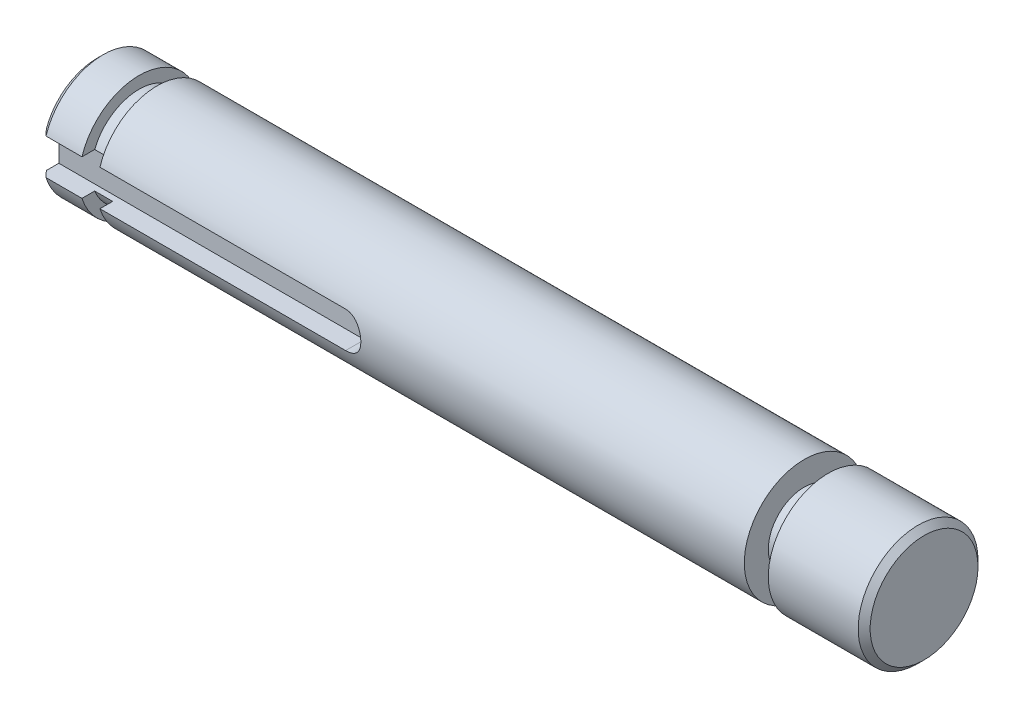
ISO-10303-21;
HEADER;
FILE_DESCRIPTION(('STEP AP214'),'2;1');
FILE_NAME('part.step','',(''),(''),'','','');
FILE_SCHEMA(('AUTOMOTIVE_DESIGN { 1 0 10303 214 1 1 1 1 }'));
ENDSEC;
DATA;
#1=APPLICATION_CONTEXT('core data for automotive mechanical design processes');
#2=APPLICATION_PROTOCOL_DEFINITION('international standard','automotive_design',2000,#1);
#3=PRODUCT_CONTEXT('',#1,'mechanical');
#4=PRODUCT('Part','Part','',(#3));
#5=PRODUCT_RELATED_PRODUCT_CATEGORY('part','',(#4));
#6=PRODUCT_DEFINITION_FORMATION('','',#4);
#7=PRODUCT_DEFINITION_CONTEXT('part definition',#1,'design');
#8=PRODUCT_DEFINITION('design','',#6,#7);
#9=PRODUCT_DEFINITION_SHAPE('','',#8);
#10=(LENGTH_UNIT() NAMED_UNIT(*) SI_UNIT(.MILLI.,.METRE.));
#11=(NAMED_UNIT(*) PLANE_ANGLE_UNIT() SI_UNIT($,.RADIAN.));
#12=(NAMED_UNIT(*) SI_UNIT($,.STERADIAN.) SOLID_ANGLE_UNIT());
#13=UNCERTAINTY_MEASURE_WITH_UNIT(LENGTH_MEASURE(1.E-05),#10,'distance_accuracy_value','');
#14=(GEOMETRIC_REPRESENTATION_CONTEXT(3) GLOBAL_UNCERTAINTY_ASSIGNED_CONTEXT((#13)) GLOBAL_UNIT_ASSIGNED_CONTEXT((#10,
#11,#12)) REPRESENTATION_CONTEXT('',''));
#15=CARTESIAN_POINT('',(0.,0.,0.));
#16=DIRECTION('',(0.,0.,1.));
#17=DIRECTION('',(1.,0.,0.));
#18=AXIS2_PLACEMENT_3D('',#15,#16,#17);
#19=CARTESIAN_POINT('',(34.5,0.,0.));
#20=DIRECTION('',(-1.,0.,0.));
#21=DIRECTION('',(0.,0.,1.));
#22=AXIS2_PLACEMENT_3D('',#19,#20,#21);
#23=CYLINDRICAL_SURFACE('',#22,5.);
#24=CARTESIAN_POINT('',(24.5,0.,0.));
#25=DIRECTION('',(1.,0.,0.));
#26=DIRECTION('',(0.,0.,-1.));
#27=AXIS2_PLACEMENT_3D('',#24,#25,#26);
#28=CIRCLE('',#27,5.);
#29=CARTESIAN_POINT('',(24.5,0.,-5.));
#30=VERTEX_POINT('',#29);
#31=EDGE_CURVE('E218',#30,#30,#28,.T.);
#32=ORIENTED_EDGE('',*,*,#31,.F.);
#33=EDGE_LOOP('',(#32));
#34=FACE_BOUND('',#33,.T.);
#35=DIRECTION('',(-1.,0.,0.));
#36=VECTOR('',#35,1.);
#37=CARTESIAN_POINT('',(34.5,-1.5,4.76969600708473));
#38=LINE('',#37,#36);
#39=CARTESIAN_POINT('',(-29.5,-1.5,4.76969600708473));
#40=VERTEX_POINT('',#39);
#41=CARTESIAN_POINT('',(-9.00000000000001,-1.5,4.76969600708473));
#42=VERTEX_POINT('',#41);
#43=EDGE_CURVE('E179',#40,#42,#38,.F.);
#44=ORIENTED_EDGE('',*,*,#43,.F.);
#45=CARTESIAN_POINT('',(-29.5,0.,0.));
#46=DIRECTION('',(-1.,0.,0.));
#47=DIRECTION('',(0.,0.,1.));
#48=AXIS2_PLACEMENT_3D('',#45,#46,#47);
#49=CIRCLE('',#48,5.);
#50=CARTESIAN_POINT('',(-29.5,1.5,4.76969600708473));
#51=VERTEX_POINT('',#50);
#52=EDGE_CURVE('E202',#51,#40,#49,.T.);
#53=ORIENTED_EDGE('',*,*,#52,.F.);
#54=DIRECTION('',(-1.,0.,0.));
#55=VECTOR('',#54,1.);
#56=CARTESIAN_POINT('',(34.5,1.5,4.76969600708473));
#57=LINE('',#56,#55);
#58=CARTESIAN_POINT('',(-9.00000000000001,1.5,4.76969600708473));
#59=VERTEX_POINT('',#58);
#60=EDGE_CURVE('E81',#59,#51,#57,.T.);
#61=ORIENTED_EDGE('',*,*,#60,.F.);
#62=CARTESIAN_POINT('',(-9.00000000000001,-1.5,4.76969600708473));
#63=CARTESIAN_POINT('',(-8.95882060709199,-1.50000085357071,4.76969249084934));
#64=CARTESIAN_POINT('',(-8.91766195687388,-1.49830317083428,4.77022997000129));
#65=CARTESIAN_POINT('',(-8.83565883790444,-1.49153785660317,4.77235095109999));
#66=CARTESIAN_POINT('',(-8.79481430060511,-1.48647098275841,4.77393421787376));
#67=CARTESIAN_POINT('',(-8.67340945904534,-1.46630203689311,4.78018490618873));
#68=CARTESIAN_POINT('',(-8.59369360958363,-1.44623120413662,4.78635370384275));
#69=CARTESIAN_POINT('',(-8.43896442161414,-1.39353102315626,4.80195952113208));
#70=CARTESIAN_POINT('',(-8.36394944780192,-1.36090607068203,4.81139539670393));
#71=CARTESIAN_POINT('',(-8.22040331840241,-1.28407841117655,4.83246571212052));
#72=CARTESIAN_POINT('',(-8.15187520027157,-1.23987031651226,4.84410117434933));
#73=CARTESIAN_POINT('',(-8.02113394400295,-1.13964850658326,4.86866835244721));
#74=CARTESIAN_POINT('',(-7.95915633965661,-1.08333433465208,4.88162755412974));
#75=CARTESIAN_POINT('',(-7.84536441610004,-0.961138919873354,4.90714811559049));
#76=CARTESIAN_POINT('',(-7.79355181399695,-0.895256063916348,4.91970940785249));
#77=CARTESIAN_POINT('',(-7.70053622968151,-0.75410992131543,4.94333239727705));
#78=CARTESIAN_POINT('',(-7.65957481970205,-0.678680819336259,4.95435770971354));
#79=CARTESIAN_POINT('',(-7.59101158838185,-0.521621185505775,4.97334469846208));
#80=CARTESIAN_POINT('',(-7.56340632220573,-0.439992259012928,4.98130716463903));
#81=CARTESIAN_POINT('',(-7.52312020089796,-0.275324697874879,4.99307639935002));
#82=CARTESIAN_POINT('',(-7.51003514203026,-0.192393125294255,4.99699549276993));
#83=CARTESIAN_POINT('',(-7.49788265863674,-0.0254235719980831,5.00063202022426));
#84=CARTESIAN_POINT('',(-7.49881258029984,0.0586141962423611,5.00035024971471));
#85=CARTESIAN_POINT('',(-7.514392908759,0.222571599946016,4.99569602566267));
#86=CARTESIAN_POINT('',(-7.52860534497872,0.30253714546464,4.99145415509187));
#87=CARTESIAN_POINT('',(-7.56963163523811,0.458890052102024,4.9795151369998));
#88=CARTESIAN_POINT('',(-7.59644614945594,0.535277225531996,4.97181780846028));
#89=CARTESIAN_POINT('',(-7.66221222164644,0.683347815892215,4.95365214926145));
#90=CARTESIAN_POINT('',(-7.70130164435695,0.754966006044141,4.94315255692525));
#91=CARTESIAN_POINT('',(-7.79039859004832,0.890765529574419,4.92049624651755));
#92=CARTESIAN_POINT('',(-7.84040855947884,0.954945191614594,4.90833915735884));
#93=CARTESIAN_POINT('',(-7.95219198808351,1.07665450541275,4.88311673571409));
#94=CARTESIAN_POINT('',(-8.01434386376075,1.13383351478034,4.87003445449554));
#95=CARTESIAN_POINT('',(-8.14749742342792,1.23706769492487,4.84484215114658));
#96=CARTESIAN_POINT('',(-8.21850168036553,1.28311962013078,4.83273241337565));
#97=CARTESIAN_POINT('',(-8.36828092844929,1.36316407240863,4.81077228795653));
#98=CARTESIAN_POINT('',(-8.44712717959341,1.39703006341134,4.80094596245948));
#99=CARTESIAN_POINT('',(-8.60972450398175,1.45085886004699,4.78495663653201));
#100=CARTESIAN_POINT('',(-8.69346786071438,1.47084293218035,4.77878803475875));
#101=CARTESIAN_POINT('',(-8.81499488907019,1.4890120359008,4.77314032325006));
#102=CARTESIAN_POINT('',(-8.85189073417961,1.49313202989009,4.77185156275267));
#103=CARTESIAN_POINT('',(-8.92585147909953,1.49862355614854,4.77012928611782));
#104=CARTESIAN_POINT('',(-8.96291604966386,1.49999912968269,4.76969451246644));
#105=CARTESIAN_POINT('',(-9.00000000000001,1.5,4.76969600708473));
#106=B_SPLINE_CURVE_WITH_KNOTS('',3,(#62,#63,#64,#65,#66,#67,#68,#69,#70,#71,#72,#73,#74,#75,
#76,#77,#78,#79,#80,#81,#82,#83,#84,#85,#86,#87,#88,#89,#90,#91,#92,#93,#94,#95,#96,#97,#98,#99,
#100,#101,#102,#103,#104,#105),.UNSPECIFIED.,.F.,.F.,(4,2,2,2,2,2,2,2,2,2,2,2,2,2,2,2,2,2,2,2,2,
4),(0.,0.123459071219734,0.246890388853042,0.49291134961521,0.738846245884323,0.984895736828092,
1.23795510798803,1.49105719006936,1.74939356197455,2.00766326783256,2.25854751319802,
2.5093842528947,2.75223130012966,2.99509107067835,3.2407824256273,3.48652887757005,
3.74172568310981,3.99699683536777,4.25484698071527,4.51230123440207,4.62365084745808,
4.73483637253615),.UNSPECIFIED.);
#107=EDGE_CURVE('E11',#42,#59,#106,.T.);
#108=ORIENTED_EDGE('',*,*,#107,.F.);
#109=EDGE_LOOP('',(#44,#53,#61,#108));
#110=FACE_BOUND('',#109,.T.);
#111=ADVANCED_FACE('F50',(#34,#110),#23,.T.);
#112=CARTESIAN_POINT('',(-31.,0.,0.));
#113=DIRECTION('',(-1.,0.,0.));
#114=DIRECTION('',(0.,0.,1.));
#115=AXIS2_PLACEMENT_3D('',#112,#113,#114);
#116=PLANE('',#115);
#117=DIRECTION('',(0.,0.,1.));
#118=VECTOR('',#117,1.);
#119=CARTESIAN_POINT('',(-31.,1.5,0.));
#120=LINE('',#119,#118);
#121=CARTESIAN_POINT('',(-31.,1.5,3.70809924354783));
#122=VERTEX_POINT('',#121);
#123=CARTESIAN_POINT('',(-31.,1.5,4.76969600708473));
#124=VERTEX_POINT('',#123);
#125=EDGE_CURVE('E186',#122,#124,#120,.T.);
#126=ORIENTED_EDGE('',*,*,#125,.F.);
#127=CARTESIAN_POINT('',(-31.,0.,0.));
#128=DIRECTION('',(-1.,0.,0.));
#129=DIRECTION('',(0.,0.,1.));
#130=AXIS2_PLACEMENT_3D('',#127,#128,#129);
#131=CIRCLE('',#130,4.);
#132=CARTESIAN_POINT('',(-31.,-1.5,3.70809924354783));
#133=VERTEX_POINT('',#132);
#134=EDGE_CURVE('E198',#122,#133,#131,.T.);
#135=ORIENTED_EDGE('',*,*,#134,.T.);
#136=DIRECTION('',(0.,0.,-1.));
#137=VECTOR('',#136,1.);
#138=CARTESIAN_POINT('',(-31.,-1.5,0.));
#139=LINE('',#138,#137);
#140=CARTESIAN_POINT('',(-31.,-1.5,4.76969600708473));
#141=VERTEX_POINT('',#140);
#142=EDGE_CURVE('E169',#141,#133,#139,.T.);
#143=ORIENTED_EDGE('',*,*,#142,.F.);
#144=CARTESIAN_POINT('',(-31.,0.,0.));
#145=DIRECTION('',(-1.,0.,0.));
#146=DIRECTION('',(0.,0.,1.));
#147=AXIS2_PLACEMENT_3D('',#144,#145,#146);
#148=CIRCLE('',#147,5.);
#149=EDGE_CURVE('E206',#124,#141,#148,.T.);
#150=ORIENTED_EDGE('',*,*,#149,.F.);
#151=EDGE_LOOP('',(#126,#135,#143,#150));
#152=FACE_BOUND('',#151,.T.);
#153=ADVANCED_FACE('F273',(#152),#116,.F.);
#154=CARTESIAN_POINT('',(-29.5,0.,0.));
#155=DIRECTION('',(-1.,0.,0.));
#156=DIRECTION('',(0.,0.,1.));
#157=AXIS2_PLACEMENT_3D('',#154,#155,#156);
#158=PLANE('',#157);
#159=CARTESIAN_POINT('',(-29.5,0.,0.));
#160=DIRECTION('',(-1.,0.,0.));
#161=DIRECTION('',(0.,0.,1.));
#162=AXIS2_PLACEMENT_3D('',#159,#160,#161);
#163=CIRCLE('',#162,4.);
#164=CARTESIAN_POINT('',(-29.5,1.5,3.70809924354783));
#165=VERTEX_POINT('',#164);
#166=CARTESIAN_POINT('',(-29.5,-1.5,3.70809924354783));
#167=VERTEX_POINT('',#166);
#168=EDGE_CURVE('E197',#165,#167,#163,.T.);
#169=ORIENTED_EDGE('',*,*,#168,.F.);
#170=DIRECTION('',(0.,0.,1.));
#171=VECTOR('',#170,1.);
#172=CARTESIAN_POINT('',(-29.5,1.5,0.));
#173=LINE('',#172,#171);
#174=EDGE_CURVE('E192',#165,#51,#173,.T.);
#175=ORIENTED_EDGE('',*,*,#174,.T.);
#176=ORIENTED_EDGE('',*,*,#52,.T.);
#177=DIRECTION('',(0.,0.,-1.));
#178=VECTOR('',#177,1.);
#179=CARTESIAN_POINT('',(-29.5,-1.5,0.));
#180=LINE('',#179,#178);
#181=EDGE_CURVE('E175',#40,#167,#180,.T.);
#182=ORIENTED_EDGE('',*,*,#181,.T.);
#183=EDGE_LOOP('',(#169,#175,#176,#182));
#184=FACE_BOUND('',#183,.T.);
#185=ADVANCED_FACE('F271',(#184),#158,.T.);
#186=CARTESIAN_POINT('',(-31.,0.,0.));
#187=DIRECTION('',(1.,0.,0.));
#188=DIRECTION('',(0.,0.,-1.));
#189=AXIS2_PLACEMENT_3D('',#186,#187,#188);
#190=CYLINDRICAL_SURFACE('',#189,4.);
#191=DIRECTION('',(1.,0.,0.));
#192=VECTOR('',#191,1.);
#193=CARTESIAN_POINT('',(-31.,1.5,3.70809924354783));
#194=LINE('',#193,#192);
#195=EDGE_CURVE('E189',#165,#122,#194,.F.);
#196=ORIENTED_EDGE('',*,*,#195,.F.);
#197=ORIENTED_EDGE('',*,*,#168,.T.);
#198=DIRECTION('',(1.,0.,0.));
#199=VECTOR('',#198,1.);
#200=CARTESIAN_POINT('',(-31.,-1.5,3.70809924354783));
#201=LINE('',#200,#199);
#202=EDGE_CURVE('E172',#133,#167,#201,.T.);
#203=ORIENTED_EDGE('',*,*,#202,.F.);
#204=ORIENTED_EDGE('',*,*,#134,.F.);
#205=EDGE_LOOP('',(#196,#197,#203,#204));
#206=FACE_BOUND('',#205,.T.);
#207=ADVANCED_FACE('F268',(#206),#190,.T.);
#208=CARTESIAN_POINT('',(-34.5,0.,0.));
#209=DIRECTION('',(1.,0.,0.));
#210=DIRECTION('',(0.,0.,-1.));
#211=AXIS2_PLACEMENT_3D('',#208,#209,#210);
#212=PLANE('',#211);
#213=DIRECTION('',(0.,0.,-1.));
#214=VECTOR('',#213,1.);
#215=CARTESIAN_POINT('',(-34.5,1.5,5.));
#216=LINE('',#215,#214);
#217=CARTESIAN_POINT('',(-34.5,1.5,4.24264068711928));
#218=VERTEX_POINT('',#217);
#219=CARTESIAN_POINT('',(-34.5,1.5,3.2));
#220=VERTEX_POINT('',#219);
#221=EDGE_CURVE('E129',#218,#220,#216,.T.);
#222=ORIENTED_EDGE('',*,*,#221,.F.);
#223=CARTESIAN_POINT('',(-34.5,0.,0.));
#224=DIRECTION('',(1.,0.,0.));
#225=DIRECTION('',(0.,0.,-1.));
#226=AXIS2_PLACEMENT_3D('',#223,#224,#225);
#227=CIRCLE('',#226,4.5);
#228=CARTESIAN_POINT('',(-34.5,-1.5,4.24264068711928));
#229=VERTEX_POINT('',#228);
#230=EDGE_CURVE('E233',#218,#229,#227,.F.);
#231=ORIENTED_EDGE('',*,*,#230,.T.);
#232=DIRECTION('',(0.,0.,-1.));
#233=VECTOR('',#232,1.);
#234=CARTESIAN_POINT('',(-34.5,-1.5,5.));
#235=LINE('',#234,#233);
#236=CARTESIAN_POINT('',(-34.5,-1.5,3.2));
#237=VERTEX_POINT('',#236);
#238=EDGE_CURVE('E73',#229,#237,#235,.T.);
#239=ORIENTED_EDGE('',*,*,#238,.T.);
#240=DIRECTION('',(0.,-1.,0.));
#241=VECTOR('',#240,1.);
#242=CARTESIAN_POINT('',(-34.5,1.5,3.2));
#243=LINE('',#242,#241);
#244=EDGE_CURVE('E145',#220,#237,#243,.T.);
#245=ORIENTED_EDGE('',*,*,#244,.F.);
#246=EDGE_LOOP('',(#222,#231,#239,#245));
#247=FACE_BOUND('',#246,.T.);
#248=ADVANCED_FACE('F150',(#247),#212,.F.);
#249=DIRECTION('',(-1.,0.,0.));
#250=VECTOR('',#249,1.);
#251=CARTESIAN_POINT('',(34.5,1.5,4.76969600708473));
#252=LINE('',#251,#250);
#253=CARTESIAN_POINT('',(-34.,1.5,4.76969600708473));
#254=VERTEX_POINT('',#253);
#255=EDGE_CURVE('E183',#124,#254,#252,.T.);
#256=ORIENTED_EDGE('',*,*,#255,.F.);
#257=ORIENTED_EDGE('',*,*,#149,.T.);
#258=DIRECTION('',(-1.,0.,0.));
#259=VECTOR('',#258,1.);
#260=CARTESIAN_POINT('',(34.5,-1.5,4.76969600708473));
#261=LINE('',#260,#259);
#262=CARTESIAN_POINT('',(-34.,-1.5,4.76969600708473));
#263=VERTEX_POINT('',#262);
#264=EDGE_CURVE('E139',#263,#141,#261,.F.);
#265=ORIENTED_EDGE('',*,*,#264,.F.);
#266=CARTESIAN_POINT('',(-34.,0.,0.));
#267=DIRECTION('',(1.,0.,0.));
#268=DIRECTION('',(0.,0.,-1.));
#269=AXIS2_PLACEMENT_3D('',#266,#267,#268);
#270=CIRCLE('',#269,5.);
#271=EDGE_CURVE('E226',#263,#254,#270,.T.);
#272=ORIENTED_EDGE('',*,*,#271,.T.);
#273=EDGE_LOOP('',(#256,#257,#265,#272));
#274=FACE_BOUND('',#273,.T.);
#275=ADVANCED_FACE('F298',(#274),#23,.T.);
#276=CARTESIAN_POINT('',(-34.,0.,0.));
#277=DIRECTION('',(1.,0.,0.));
#278=DIRECTION('',(0.,0.,-1.));
#279=AXIS2_PLACEMENT_3D('',#276,#277,#278);
#280=CONICAL_SURFACE('',#279,5.,0.78539816339745);
#281=ORIENTED_EDGE('',*,*,#230,.F.);
#282=CARTESIAN_POINT('',(-36.3683541692269,1.5,2.1623042752178));
#283=CARTESIAN_POINT('',(-36.2866237657248,1.5,2.26170328637364));
#284=CARTESIAN_POINT('',(-36.2038798963738,1.5,2.36025529148754));
#285=CARTESIAN_POINT('',(-36.036817134977,1.5,2.55600046714582));
#286=CARTESIAN_POINT('',(-35.9524983981551,1.5,2.65319376997422));
#287=CARTESIAN_POINT('',(-35.7827415296879,1.5,2.8465533855744));
#288=CARTESIAN_POINT('',(-35.6973036653634,1.5,2.94271993398816));
#289=CARTESIAN_POINT('',(-35.5255461820675,1.5,3.13426650601751));
#290=CARTESIAN_POINT('',(-35.439226538211,1.5,3.2296465072975));
#291=CARTESIAN_POINT('',(-35.1793145483203,1.5,3.51479588177234));
#292=CARTESIAN_POINT('',(-35.0047097694589,1.5,3.70364165468613));
#293=CARTESIAN_POINT('',(-34.6537692558707,1.5,4.07973628866155));
#294=CARTESIAN_POINT('',(-34.4774334013733,1.5,4.26698503752823));
#295=CARTESIAN_POINT('',(-34.1214350657472,1.5,4.64263193370608));
#296=CARTESIAN_POINT('',(-33.9417581905171,1.5,4.83101642797458));
#297=CARTESIAN_POINT('',(-33.5815548756563,1.5,5.20695991744701));
#298=CARTESIAN_POINT('',(-33.4010284610052,1.5,5.39451893661304));
#299=CARTESIAN_POINT('',(-33.0392956468262,1.5,5.76908741339745));
#300=CARTESIAN_POINT('',(-32.8580890611849,1.5,5.95609669115696));
#301=CARTESIAN_POINT('',(-32.4951934856953,1.5,6.32964554688915));
#302=CARTESIAN_POINT('',(-32.3135044974066,1.5,6.51618512637664));
#303=CARTESIAN_POINT('',(-32.1316458307731,1.5,6.70255839168427));
#304=B_SPLINE_CURVE_WITH_KNOTS('',3,(#282,#283,#284,#285,#286,#287,#288,#289,#290,#291,#292,
#293,#294,#295,#296,#297,#298,#299,#300,#301,#302,#303),.UNSPECIFIED.,.F.,.F.,(4,2,2,2,2,2,2,2,
2,2,4),(0.,0.386035334138054,0.772032818161404,1.15793972383206,1.54385755063089,
2.3154246000928,3.08704541483157,3.8680359987315,4.64900376030176,5.43020358119428,
6.21140087945943),.UNSPECIFIED.);
#305=EDGE_CURVE('E66',#218,#254,#304,.T.);
#306=ORIENTED_EDGE('',*,*,#305,.T.);
#307=ORIENTED_EDGE('',*,*,#271,.F.);
#308=CARTESIAN_POINT('',(-32.1316458307731,-1.5,6.70255839168427));
#309=CARTESIAN_POINT('',(-32.3123803267365,-1.5,6.51733755149529));
#310=CARTESIAN_POINT('',(-32.4929469990267,-1.5,6.33195222922591));
#311=CARTESIAN_POINT('',(-32.8536047230969,-1.5,5.96071848634781));
#312=CARTESIAN_POINT('',(-33.0336957733682,-1.5,5.77487006427357));
#313=CARTESIAN_POINT('',(-33.3932083410732,-1.5,5.40263182040897));
#314=CARTESIAN_POINT('',(-33.5726300395824,-1.5,5.21624217362223));
#315=CARTESIAN_POINT('',(-33.9306393206229,-1.5,4.84265210588213));
#316=CARTESIAN_POINT('',(-34.1092268785068,-1.5,4.6554516612822));
#317=CARTESIAN_POINT('',(-34.465285333419,-1.5,4.27986143036192));
#318=CARTESIAN_POINT('',(-34.6427558002925,-1.5,4.09147123590069));
#319=CARTESIAN_POINT('',(-34.9959576432083,-1.5,3.71308595327027));
#320=CARTESIAN_POINT('',(-35.1716891398876,-1.5,3.52309097814808));
#321=CARTESIAN_POINT('',(-35.433278583921,-1.5,3.23620510413928));
#322=CARTESIAN_POINT('',(-35.5201553971391,-1.5,3.14024402220524));
#323=CARTESIAN_POINT('',(-35.6930205100701,-1.5,2.94752907377065));
#324=CARTESIAN_POINT('',(-35.7790088351168,-1.5,2.85077523001627));
#325=CARTESIAN_POINT('',(-35.9498569101993,-1.5,2.65623165702576));
#326=CARTESIAN_POINT('',(-36.0347163892213,-1.5,2.55844168881037));
#327=CARTESIAN_POINT('',(-36.2028438730114,-1.5,2.36148836466358));
#328=CARTESIAN_POINT('',(-36.2861117192461,-1.5,2.26232487360266));
#329=CARTESIAN_POINT('',(-36.3683541692269,-1.5,2.1623042752178));
#330=B_SPLINE_CURVE_WITH_KNOTS('',3,(#308,#309,#310,#311,#312,#313,#314,#315,#316,#317,#318,
#319,#320,#321,#322,#323,#324,#325,#326,#327,#328,#329),.UNSPECIFIED.,.F.,.F.,(4,2,2,2,2,2,2,2,
2,2,4),(0.,0.776367513826787,1.55273748765964,2.32887948544042,3.10504427357709,
3.88149160324207,4.65788468567819,5.04621660351842,5.43453741796585,5.82294983655364,
6.21140074313658),.UNSPECIFIED.);
#331=EDGE_CURVE('E244',#263,#229,#330,.T.);
#332=ORIENTED_EDGE('',*,*,#331,.T.);
#333=EDGE_LOOP('',(#281,#306,#307,#332));
#334=FACE_BOUND('',#333,.T.);
#335=ADVANCED_FACE('F257',(#334),#280,.T.);
#336=CARTESIAN_POINT('',(34.,0.,0.));
#337=DIRECTION('',(1.,0.,0.));
#338=DIRECTION('',(0.,0.,-1.));
#339=AXIS2_PLACEMENT_3D('',#336,#337,#338);
#340=CIRCLE('',#339,5.);
#341=CARTESIAN_POINT('',(34.,0.,-5.));
#342=VERTEX_POINT('',#341);
#343=EDGE_CURVE('E240',#342,#342,#340,.F.);
#344=ORIENTED_EDGE('',*,*,#343,.T.);
#345=EDGE_LOOP('',(#344));
#346=FACE_BOUND('',#345,.T.);
#347=CARTESIAN_POINT('',(26.5,0.,0.));
#348=DIRECTION('',(1.,0.,0.));
#349=DIRECTION('',(0.,0.,-1.));
#350=AXIS2_PLACEMENT_3D('',#347,#348,#349);
#351=CIRCLE('',#350,5.);
#352=CARTESIAN_POINT('',(26.5,0.,-5.));
#353=VERTEX_POINT('',#352);
#354=EDGE_CURVE('E222',#353,#353,#351,.T.);
#355=ORIENTED_EDGE('',*,*,#354,.T.);
#356=EDGE_LOOP('',(#355));
#357=FACE_BOUND('',#356,.T.);
#358=ADVANCED_FACE('F295',(#346,#357),#23,.T.);
#359=CARTESIAN_POINT('',(34.5,0.,0.));
#360=DIRECTION('',(1.,0.,0.));
#361=DIRECTION('',(0.,0.,-1.));
#362=AXIS2_PLACEMENT_3D('',#359,#360,#361);
#363=PLANE('',#362);
#364=CARTESIAN_POINT('',(34.5,0.,0.));
#365=DIRECTION('',(1.,0.,0.));
#366=DIRECTION('',(0.,0.,-1.));
#367=AXIS2_PLACEMENT_3D('',#364,#365,#366);
#368=CIRCLE('',#367,4.50000000000002);
#369=CARTESIAN_POINT('',(34.5,0.,-4.50000000000002));
#370=VERTEX_POINT('',#369);
#371=EDGE_CURVE('E236',#370,#370,#368,.T.);
#372=ORIENTED_EDGE('',*,*,#371,.T.);
#373=EDGE_LOOP('',(#372));
#374=FACE_BOUND('',#373,.T.);
#375=ADVANCED_FACE('F288',(#374),#363,.T.);
#376=CARTESIAN_POINT('',(26.5,0.,0.));
#377=DIRECTION('',(1.,0.,0.));
#378=DIRECTION('',(0.,0.,-1.));
#379=AXIS2_PLACEMENT_3D('',#376,#377,#378);
#380=PLANE('',#379);
#381=ORIENTED_EDGE('',*,*,#354,.F.);
#382=EDGE_LOOP('',(#381));
#383=FACE_BOUND('',#382,.T.);
#384=CARTESIAN_POINT('',(26.5,0.,0.));
#385=DIRECTION('',(1.,0.,0.));
#386=DIRECTION('',(0.,0.,-1.));
#387=AXIS2_PLACEMENT_3D('',#384,#385,#386);
#388=CIRCLE('',#387,3.);
#389=CARTESIAN_POINT('',(26.5,0.,-3.));
#390=VERTEX_POINT('',#389);
#391=EDGE_CURVE('E214',#390,#390,#388,.T.);
#392=ORIENTED_EDGE('',*,*,#391,.T.);
#393=EDGE_LOOP('',(#392));
#394=FACE_BOUND('',#393,.T.);
#395=ADVANCED_FACE('F285',(#383,#394),#380,.F.);
#396=CARTESIAN_POINT('',(24.5,0.,0.));
#397=DIRECTION('',(1.,0.,0.));
#398=DIRECTION('',(0.,0.,-1.));
#399=AXIS2_PLACEMENT_3D('',#396,#397,#398);
#400=PLANE('',#399);
#401=ORIENTED_EDGE('',*,*,#31,.T.);
#402=EDGE_LOOP('',(#401));
#403=FACE_BOUND('',#402,.T.);
#404=CARTESIAN_POINT('',(24.5,0.,0.));
#405=DIRECTION('',(1.,0.,0.));
#406=DIRECTION('',(0.,0.,-1.));
#407=AXIS2_PLACEMENT_3D('',#404,#405,#406);
#408=CIRCLE('',#407,3.);
#409=CARTESIAN_POINT('',(24.5,0.,-3.));
#410=VERTEX_POINT('',#409);
#411=EDGE_CURVE('E210',#410,#410,#408,.T.);
#412=ORIENTED_EDGE('',*,*,#411,.F.);
#413=EDGE_LOOP('',(#412));
#414=FACE_BOUND('',#413,.T.);
#415=ADVANCED_FACE('F283',(#403,#414),#400,.T.);
#416=CARTESIAN_POINT('',(26.5,0.,0.));
#417=DIRECTION('',(-1.,0.,0.));
#418=DIRECTION('',(0.,0.,1.));
#419=AXIS2_PLACEMENT_3D('',#416,#417,#418);
#420=CYLINDRICAL_SURFACE('',#419,3.);
#421=ORIENTED_EDGE('',*,*,#391,.F.);
#422=EDGE_LOOP('',(#421));
#423=FACE_BOUND('',#422,.T.);
#424=ORIENTED_EDGE('',*,*,#411,.T.);
#425=EDGE_LOOP('',(#424));
#426=FACE_BOUND('',#425,.T.);
#427=ADVANCED_FACE('F280',(#423,#426),#420,.T.);
#428=CARTESIAN_POINT('',(34.5,0.,0.));
#429=DIRECTION('',(-1.,0.,0.));
#430=DIRECTION('',(0.,0.,1.));
#431=AXIS2_PLACEMENT_3D('',#428,#429,#430);
#432=CONICAL_SURFACE('',#431,4.50000000000002,0.785398163397443);
#433=ORIENTED_EDGE('',*,*,#343,.F.);
#434=EDGE_LOOP('',(#433));
#435=FACE_BOUND('',#434,.T.);
#436=ORIENTED_EDGE('',*,*,#371,.F.);
#437=EDGE_LOOP('',(#436));
#438=FACE_BOUND('',#437,.T.);
#439=ADVANCED_FACE('F53',(#435,#438),#432,.T.);
#440=CARTESIAN_POINT('',(-9.00000000000001,0.,5.));
#441=DIRECTION('',(0.,0.,-1.));
#442=DIRECTION('',(-1.,0.,0.));
#443=AXIS2_PLACEMENT_3D('',#440,#441,#442);
#444=CYLINDRICAL_SURFACE('',#443,1.5);
#445=DIRECTION('',(0.,0.,-1.));
#446=VECTOR('',#445,1.);
#447=CARTESIAN_POINT('',(-9.00000000000001,-1.5,5.));
#448=LINE('',#447,#446);
#449=CARTESIAN_POINT('',(-9.00000000000001,-1.5,3.2));
#450=VERTEX_POINT('',#449);
#451=EDGE_CURVE('E162',#42,#450,#448,.T.);
#452=ORIENTED_EDGE('',*,*,#451,.F.);
#453=ORIENTED_EDGE('',*,*,#107,.T.);
#454=DIRECTION('',(0.,0.,-1.));
#455=VECTOR('',#454,1.);
#456=CARTESIAN_POINT('',(-9.00000000000001,1.5,5.));
#457=LINE('',#456,#455);
#458=CARTESIAN_POINT('',(-9.00000000000001,1.5,3.2));
#459=VERTEX_POINT('',#458);
#460=EDGE_CURVE('E159',#59,#459,#457,.T.);
#461=ORIENTED_EDGE('',*,*,#460,.T.);
#462=CARTESIAN_POINT('',(-9.00000000000001,0.,3.2));
#463=DIRECTION('',(0.,0.,1.));
#464=DIRECTION('',(1.,0.,0.));
#465=AXIS2_PLACEMENT_3D('',#462,#463,#464);
#466=CIRCLE('',#465,1.5);
#467=EDGE_CURVE('E147',#450,#459,#466,.T.);
#468=ORIENTED_EDGE('',*,*,#467,.F.);
#469=EDGE_LOOP('',(#452,#453,#461,#468));
#470=FACE_BOUND('',#469,.T.);
#471=ADVANCED_FACE('F262',(#470),#444,.F.);
#472=CARTESIAN_POINT('',(-34.5,1.5,5.));
#473=DIRECTION('',(0.,-1.,0.));
#474=DIRECTION('',(0.,0.,-1.));
#475=AXIS2_PLACEMENT_3D('',#472,#473,#474);
#476=PLANE('',#475);
#477=ORIENTED_EDGE('',*,*,#60,.T.);
#478=ORIENTED_EDGE('',*,*,#174,.F.);
#479=ORIENTED_EDGE('',*,*,#195,.T.);
#480=ORIENTED_EDGE('',*,*,#125,.T.);
#481=ORIENTED_EDGE('',*,*,#255,.T.);
#482=ORIENTED_EDGE('',*,*,#305,.F.);
#483=ORIENTED_EDGE('',*,*,#221,.T.);
#484=DIRECTION('',(-1.,0.,0.));
#485=VECTOR('',#484,1.);
#486=CARTESIAN_POINT('',(-34.5,1.5,3.2));
#487=LINE('',#486,#485);
#488=EDGE_CURVE('E132',#459,#220,#487,.T.);
#489=ORIENTED_EDGE('',*,*,#488,.F.);
#490=ORIENTED_EDGE('',*,*,#460,.F.);
#491=EDGE_LOOP('',(#477,#478,#479,#480,#481,#482,#483,#489,#490));
#492=FACE_BOUND('',#491,.T.);
#493=ADVANCED_FACE('F131',(#492),#476,.T.);
#494=CARTESIAN_POINT('',(-34.5,-1.5,5.));
#495=DIRECTION('',(0.,1.,0.));
#496=DIRECTION('',(0.,0.,1.));
#497=AXIS2_PLACEMENT_3D('',#494,#495,#496);
#498=PLANE('',#497);
#499=ORIENTED_EDGE('',*,*,#43,.T.);
#500=ORIENTED_EDGE('',*,*,#451,.T.);
#501=DIRECTION('',(1.,0.,0.));
#502=VECTOR('',#501,1.);
#503=CARTESIAN_POINT('',(-34.5,-1.5,3.2));
#504=LINE('',#503,#502);
#505=EDGE_CURVE('E152',#237,#450,#504,.T.);
#506=ORIENTED_EDGE('',*,*,#505,.F.);
#507=ORIENTED_EDGE('',*,*,#238,.F.);
#508=ORIENTED_EDGE('',*,*,#331,.F.);
#509=ORIENTED_EDGE('',*,*,#264,.T.);
#510=ORIENTED_EDGE('',*,*,#142,.T.);
#511=ORIENTED_EDGE('',*,*,#202,.T.);
#512=ORIENTED_EDGE('',*,*,#181,.F.);
#513=EDGE_LOOP('',(#499,#500,#506,#507,#508,#509,#510,#511,#512));
#514=FACE_BOUND('',#513,.T.);
#515=ADVANCED_FACE('F259',(#514),#498,.T.);
#516=CARTESIAN_POINT('',(-9.00000000000001,0.,3.2));
#517=DIRECTION('',(0.,0.,1.));
#518=DIRECTION('',(1.,0.,0.));
#519=AXIS2_PLACEMENT_3D('',#516,#517,#518);
#520=PLANE('',#519);
#521=ORIENTED_EDGE('',*,*,#488,.T.);
#522=ORIENTED_EDGE('',*,*,#244,.T.);
#523=ORIENTED_EDGE('',*,*,#505,.T.);
#524=ORIENTED_EDGE('',*,*,#467,.T.);
#525=EDGE_LOOP('',(#521,#522,#523,#524));
#526=FACE_BOUND('',#525,.T.);
#527=ADVANCED_FACE('F143',(#526),#520,.T.);
#528=CLOSED_SHELL('',(#111,#153,#185,#207,#248,#275,#335,#358,#375,#395,#415,#427,#439,#471,
#493,#515,#527));
#529=MANIFOLD_SOLID_BREP('B2',#528);
#530=ADVANCED_BREP_SHAPE_REPRESENTATION('',(#18,#529),#14);
#531=SHAPE_DEFINITION_REPRESENTATION(#9,#530);
ENDSEC;
END-ISO-10303-21;
